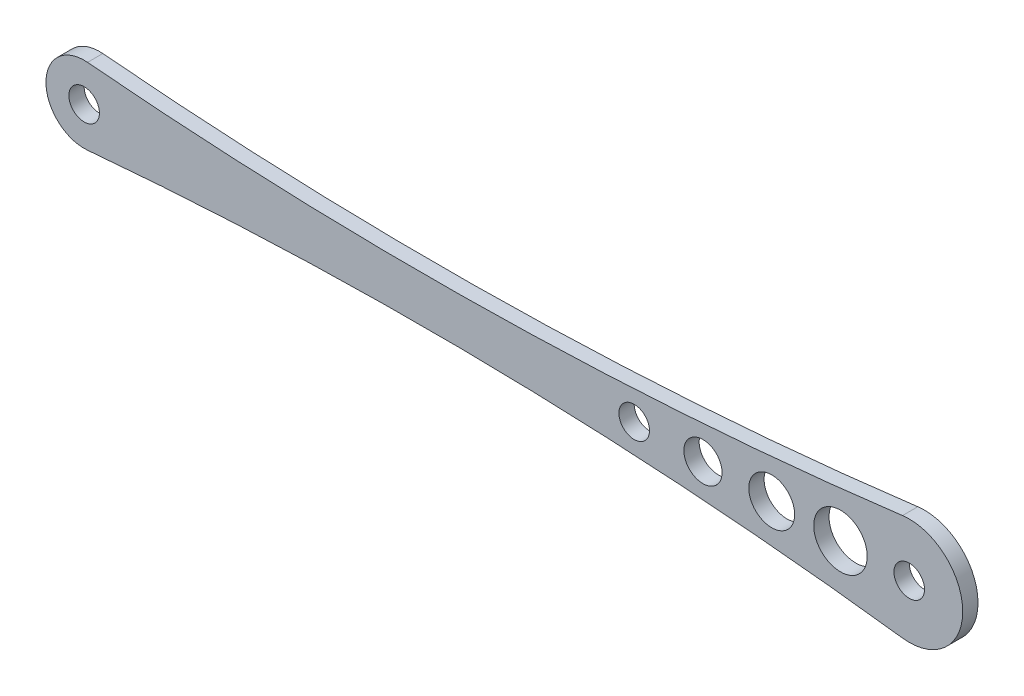
ISO-10303-21;
HEADER;
FILE_DESCRIPTION(('STEP AP214'),'2;1');
FILE_NAME('part.step','',(''),(''),'','','');
FILE_SCHEMA(('AUTOMOTIVE_DESIGN { 1 0 10303 214 1 1 1 1 }'));
ENDSEC;
DATA;
#1=APPLICATION_CONTEXT('core data for automotive mechanical design processes');
#2=APPLICATION_PROTOCOL_DEFINITION('international standard','automotive_design',2000,#1);
#3=PRODUCT_CONTEXT('',#1,'mechanical');
#4=PRODUCT('Part','Part','',(#3));
#5=PRODUCT_RELATED_PRODUCT_CATEGORY('part','',(#4));
#6=PRODUCT_DEFINITION_FORMATION('','',#4);
#7=PRODUCT_DEFINITION_CONTEXT('part definition',#1,'design');
#8=PRODUCT_DEFINITION('design','',#6,#7);
#9=PRODUCT_DEFINITION_SHAPE('','',#8);
#10=(LENGTH_UNIT() NAMED_UNIT(*) SI_UNIT(.MILLI.,.METRE.));
#11=(NAMED_UNIT(*) PLANE_ANGLE_UNIT() SI_UNIT($,.RADIAN.));
#12=(NAMED_UNIT(*) SI_UNIT($,.STERADIAN.) SOLID_ANGLE_UNIT());
#13=UNCERTAINTY_MEASURE_WITH_UNIT(LENGTH_MEASURE(1.E-05),#10,'distance_accuracy_value','');
#14=(GEOMETRIC_REPRESENTATION_CONTEXT(3) GLOBAL_UNCERTAINTY_ASSIGNED_CONTEXT((#13)) GLOBAL_UNIT_ASSIGNED_CONTEXT((#10,
#11,#12)) REPRESENTATION_CONTEXT('',''));
#15=CARTESIAN_POINT('',(0.,0.,0.));
#16=DIRECTION('',(0.,0.,1.));
#17=DIRECTION('',(1.,0.,0.));
#18=AXIS2_PLACEMENT_3D('',#15,#16,#17);
#19=CARTESIAN_POINT('',(38.1772183376422,124.680209767324,1.));
#20=DIRECTION('',(0.,0.,1.));
#21=DIRECTION('',(1.,0.,0.));
#22=AXIS2_PLACEMENT_3D('',#19,#20,#21);
#23=PLANE('',#22);
#24=CARTESIAN_POINT('',(40.5,0.,1.));
#25=DIRECTION('',(0.,0.,1.));
#26=DIRECTION('',(1.,0.,0.));
#27=AXIS2_PLACEMENT_3D('',#24,#25,#26);
#28=CIRCLE('',#27,1.25);
#29=CARTESIAN_POINT('',(41.75,0.,1.));
#30=VERTEX_POINT('',#29);
#31=EDGE_CURVE('E139',#30,#30,#28,.T.);
#32=ORIENTED_EDGE('',*,*,#31,.F.);
#33=EDGE_LOOP('',(#32));
#34=FACE_BOUND('',#33,.T.);
#35=CARTESIAN_POINT('',(49.5,0.,1.));
#36=DIRECTION('',(0.,0.,1.));
#37=DIRECTION('',(1.,0.,0.));
#38=AXIS2_PLACEMENT_3D('',#35,#36,#37);
#39=CIRCLE('',#38,1.75);
#40=CARTESIAN_POINT('',(51.25,0.,1.));
#41=VERTEX_POINT('',#40);
#42=EDGE_CURVE('E127',#41,#41,#39,.T.);
#43=ORIENTED_EDGE('',*,*,#42,.F.);
#44=EDGE_LOOP('',(#43));
#45=FACE_BOUND('',#44,.T.);
#46=CARTESIAN_POINT('',(0.,0.,1.));
#47=DIRECTION('',(0.,0.,1.));
#48=DIRECTION('',(1.,0.,0.));
#49=AXIS2_PLACEMENT_3D('',#46,#47,#48);
#50=CIRCLE('',#49,1.);
#51=CARTESIAN_POINT('',(1.,0.,1.));
#52=VERTEX_POINT('',#51);
#53=EDGE_CURVE('E106',#52,#52,#50,.T.);
#54=ORIENTED_EDGE('',*,*,#53,.F.);
#55=EDGE_LOOP('',(#54));
#56=FACE_BOUND('',#55,.T.);
#57=CARTESIAN_POINT('',(22.3544366752843,249.360419534648,1.));
#58=DIRECTION('',(0.,0.,-1.));
#59=DIRECTION('',(1.,0.,0.));
#60=AXIS2_PLACEMENT_3D('',#57,#58,#59);
#61=CIRCLE('',#60,247.860419534648);
#62=CARTESIAN_POINT('',(53.5593599348634,3.47215154234322,1.));
#63=VERTEX_POINT('',#62);
#64=CARTESIAN_POINT('',(0.223222551680044,2.49001439602694,1.));
#65=VERTEX_POINT('',#64);
#66=EDGE_CURVE('E91',#63,#65,#61,.T.);
#67=ORIENTED_EDGE('',*,*,#66,.T.);
#68=CARTESIAN_POINT('',(0.,0.,1.));
#69=DIRECTION('',(0.,0.,1.));
#70=DIRECTION('',(1.,0.,0.));
#71=AXIS2_PLACEMENT_3D('',#68,#69,#70);
#72=CIRCLE('',#71,2.49999999999999);
#73=CARTESIAN_POINT('',(0.223222551680044,-2.49001439602694,1.));
#74=VERTEX_POINT('',#73);
#75=EDGE_CURVE('E86',#65,#74,#72,.T.);
#76=ORIENTED_EDGE('',*,*,#75,.T.);
#77=CARTESIAN_POINT('',(22.3544366752843,-249.360419534648,1.));
#78=DIRECTION('',(0.,0.,-1.));
#79=DIRECTION('',(-1.,0.,0.));
#80=AXIS2_PLACEMENT_3D('',#77,#78,#79);
#81=CIRCLE('',#80,247.860419534648);
#82=CARTESIAN_POINT('',(53.5593599348634,-3.47215154234323,1.));
#83=VERTEX_POINT('',#82);
#84=EDGE_CURVE('E89',#74,#83,#81,.T.);
#85=ORIENTED_EDGE('',*,*,#84,.T.);
#86=CARTESIAN_POINT('',(54.,0.,1.));
#87=DIRECTION('',(0.,0.,1.));
#88=DIRECTION('',(1.,0.,0.));
#89=AXIS2_PLACEMENT_3D('',#86,#87,#88);
#90=CIRCLE('',#89,3.49999999999999);
#91=EDGE_CURVE('E56',#83,#63,#90,.T.);
#92=ORIENTED_EDGE('',*,*,#91,.T.);
#93=EDGE_LOOP('',(#67,#76,#85,#92));
#94=FACE_BOUND('',#93,.T.);
#95=CARTESIAN_POINT('',(54.,0.,1.));
#96=DIRECTION('',(0.,0.,1.));
#97=DIRECTION('',(1.,0.,0.));
#98=AXIS2_PLACEMENT_3D('',#95,#96,#97);
#99=CIRCLE('',#98,0.999999999999998);
#100=CARTESIAN_POINT('',(55.,0.,1.));
#101=VERTEX_POINT('',#100);
#102=EDGE_CURVE('E121',#101,#101,#99,.T.);
#103=ORIENTED_EDGE('',*,*,#102,.F.);
#104=EDGE_LOOP('',(#103));
#105=FACE_BOUND('',#104,.T.);
#106=CARTESIAN_POINT('',(45.,0.,1.));
#107=DIRECTION('',(0.,0.,1.));
#108=DIRECTION('',(1.,0.,0.));
#109=AXIS2_PLACEMENT_3D('',#106,#107,#108);
#110=CIRCLE('',#109,1.5);
#111=CARTESIAN_POINT('',(46.5,0.,1.));
#112=VERTEX_POINT('',#111);
#113=EDGE_CURVE('E133',#112,#112,#110,.T.);
#114=ORIENTED_EDGE('',*,*,#113,.F.);
#115=EDGE_LOOP('',(#114));
#116=FACE_BOUND('',#115,.T.);
#117=CARTESIAN_POINT('',(36.,0.,1.));
#118=DIRECTION('',(0.,0.,1.));
#119=DIRECTION('',(1.,0.,0.));
#120=AXIS2_PLACEMENT_3D('',#117,#118,#119);
#121=CIRCLE('',#120,0.999999999999998);
#122=CARTESIAN_POINT('',(37.,0.,1.));
#123=VERTEX_POINT('',#122);
#124=EDGE_CURVE('E145',#123,#123,#121,.T.);
#125=ORIENTED_EDGE('',*,*,#124,.F.);
#126=EDGE_LOOP('',(#125));
#127=FACE_BOUND('',#126,.T.);
#128=ADVANCED_FACE('F39',(#34,#45,#56,#94,#105,#116,#127),#23,.T.);
#129=CARTESIAN_POINT('',(38.1772183376422,124.680209767324,0.));
#130=DIRECTION('',(0.,0.,1.));
#131=DIRECTION('',(1.,0.,0.));
#132=AXIS2_PLACEMENT_3D('',#129,#130,#131);
#133=PLANE('',#132);
#134=CARTESIAN_POINT('',(22.3544366752843,249.360419534648,0.));
#135=DIRECTION('',(0.,0.,-1.));
#136=DIRECTION('',(1.,0.,0.));
#137=AXIS2_PLACEMENT_3D('',#134,#135,#136);
#138=CIRCLE('',#137,247.860419534648);
#139=CARTESIAN_POINT('',(53.5593599348634,3.47215154234322,0.));
#140=VERTEX_POINT('',#139);
#141=CARTESIAN_POINT('',(0.223222551680044,2.49001439602694,0.));
#142=VERTEX_POINT('',#141);
#143=EDGE_CURVE('E103',#140,#142,#138,.T.);
#144=ORIENTED_EDGE('',*,*,#143,.F.);
#145=CARTESIAN_POINT('',(54.,0.,0.));
#146=DIRECTION('',(0.,0.,1.));
#147=DIRECTION('',(1.,0.,0.));
#148=AXIS2_PLACEMENT_3D('',#145,#146,#147);
#149=CIRCLE('',#148,3.49999999999999);
#150=CARTESIAN_POINT('',(53.5593599348634,-3.47215154234323,0.));
#151=VERTEX_POINT('',#150);
#152=EDGE_CURVE('E79',#151,#140,#149,.T.);
#153=ORIENTED_EDGE('',*,*,#152,.F.);
#154=CARTESIAN_POINT('',(22.3544366752843,-249.360419534648,0.));
#155=DIRECTION('',(0.,0.,-1.));
#156=DIRECTION('',(-1.,0.,0.));
#157=AXIS2_PLACEMENT_3D('',#154,#155,#156);
#158=CIRCLE('',#157,247.860419534648);
#159=CARTESIAN_POINT('',(0.223222551680044,-2.49001439602694,0.));
#160=VERTEX_POINT('',#159);
#161=EDGE_CURVE('E73',#160,#151,#158,.T.);
#162=ORIENTED_EDGE('',*,*,#161,.F.);
#163=CARTESIAN_POINT('',(0.,0.,0.));
#164=DIRECTION('',(0.,0.,1.));
#165=DIRECTION('',(1.,0.,0.));
#166=AXIS2_PLACEMENT_3D('',#163,#164,#165);
#167=CIRCLE('',#166,2.49999999999999);
#168=EDGE_CURVE('E95',#142,#160,#167,.T.);
#169=ORIENTED_EDGE('',*,*,#168,.F.);
#170=EDGE_LOOP('',(#144,#153,#162,#169));
#171=FACE_BOUND('',#170,.T.);
#172=CARTESIAN_POINT('',(0.,0.,0.));
#173=DIRECTION('',(0.,0.,1.));
#174=DIRECTION('',(1.,0.,0.));
#175=AXIS2_PLACEMENT_3D('',#172,#173,#174);
#176=CIRCLE('',#175,1.);
#177=CARTESIAN_POINT('',(1.,0.,0.));
#178=VERTEX_POINT('',#177);
#179=EDGE_CURVE('E118',#178,#178,#176,.T.);
#180=ORIENTED_EDGE('',*,*,#179,.T.);
#181=EDGE_LOOP('',(#180));
#182=FACE_BOUND('',#181,.T.);
#183=CARTESIAN_POINT('',(54.,0.,0.));
#184=DIRECTION('',(0.,0.,1.));
#185=DIRECTION('',(1.,0.,0.));
#186=AXIS2_PLACEMENT_3D('',#183,#184,#185);
#187=CIRCLE('',#186,0.999999999999998);
#188=CARTESIAN_POINT('',(55.,0.,0.));
#189=VERTEX_POINT('',#188);
#190=EDGE_CURVE('E124',#189,#189,#187,.T.);
#191=ORIENTED_EDGE('',*,*,#190,.T.);
#192=EDGE_LOOP('',(#191));
#193=FACE_BOUND('',#192,.T.);
#194=CARTESIAN_POINT('',(49.5,0.,0.));
#195=DIRECTION('',(0.,0.,1.));
#196=DIRECTION('',(1.,0.,0.));
#197=AXIS2_PLACEMENT_3D('',#194,#195,#196);
#198=CIRCLE('',#197,1.75);
#199=CARTESIAN_POINT('',(51.25,0.,0.));
#200=VERTEX_POINT('',#199);
#201=EDGE_CURVE('E130',#200,#200,#198,.T.);
#202=ORIENTED_EDGE('',*,*,#201,.T.);
#203=EDGE_LOOP('',(#202));
#204=FACE_BOUND('',#203,.T.);
#205=CARTESIAN_POINT('',(45.,0.,0.));
#206=DIRECTION('',(0.,0.,1.));
#207=DIRECTION('',(1.,0.,0.));
#208=AXIS2_PLACEMENT_3D('',#205,#206,#207);
#209=CIRCLE('',#208,1.5);
#210=CARTESIAN_POINT('',(46.5,0.,0.));
#211=VERTEX_POINT('',#210);
#212=EDGE_CURVE('E136',#211,#211,#209,.T.);
#213=ORIENTED_EDGE('',*,*,#212,.T.);
#214=EDGE_LOOP('',(#213));
#215=FACE_BOUND('',#214,.T.);
#216=CARTESIAN_POINT('',(40.5,0.,0.));
#217=DIRECTION('',(0.,0.,1.));
#218=DIRECTION('',(1.,0.,0.));
#219=AXIS2_PLACEMENT_3D('',#216,#217,#218);
#220=CIRCLE('',#219,1.25);
#221=CARTESIAN_POINT('',(41.75,0.,0.));
#222=VERTEX_POINT('',#221);
#223=EDGE_CURVE('E142',#222,#222,#220,.T.);
#224=ORIENTED_EDGE('',*,*,#223,.T.);
#225=EDGE_LOOP('',(#224));
#226=FACE_BOUND('',#225,.T.);
#227=CARTESIAN_POINT('',(36.,0.,0.));
#228=DIRECTION('',(0.,0.,1.));
#229=DIRECTION('',(1.,0.,0.));
#230=AXIS2_PLACEMENT_3D('',#227,#228,#229);
#231=CIRCLE('',#230,0.999999999999998);
#232=CARTESIAN_POINT('',(37.,0.,0.));
#233=VERTEX_POINT('',#232);
#234=EDGE_CURVE('E148',#233,#233,#231,.T.);
#235=ORIENTED_EDGE('',*,*,#234,.T.);
#236=EDGE_LOOP('',(#235));
#237=FACE_BOUND('',#236,.T.);
#238=ADVANCED_FACE('F114',(#171,#182,#193,#204,#215,#226,#237),#133,.F.);
#239=CARTESIAN_POINT('',(22.3544366752843,249.360419534648,1.));
#240=DIRECTION('',(0.,0.,-1.));
#241=DIRECTION('',(-1.,0.,0.));
#242=AXIS2_PLACEMENT_3D('',#239,#240,#241);
#243=CYLINDRICAL_SURFACE('',#242,247.860419534648);
#244=ORIENTED_EDGE('',*,*,#143,.T.);
#245=DIRECTION('',(0.,0.,-1.));
#246=VECTOR('',#245,1.);
#247=CARTESIAN_POINT('',(0.223222551680044,2.49001439602694,1.));
#248=LINE('',#247,#246);
#249=EDGE_CURVE('E11',#65,#142,#248,.T.);
#250=ORIENTED_EDGE('',*,*,#249,.F.);
#251=ORIENTED_EDGE('',*,*,#66,.F.);
#252=DIRECTION('',(0.,0.,-1.));
#253=VECTOR('',#252,1.);
#254=CARTESIAN_POINT('',(53.5593599348634,3.47215154234322,1.));
#255=LINE('',#254,#253);
#256=EDGE_CURVE('E99',#63,#140,#255,.T.);
#257=ORIENTED_EDGE('',*,*,#256,.T.);
#258=EDGE_LOOP('',(#244,#250,#251,#257));
#259=FACE_BOUND('',#258,.T.);
#260=ADVANCED_FACE('F41',(#259),#243,.F.);
#261=CARTESIAN_POINT('',(0.,0.,1.));
#262=DIRECTION('',(0.,0.,-1.));
#263=DIRECTION('',(-1.,0.,0.));
#264=AXIS2_PLACEMENT_3D('',#261,#262,#263);
#265=CYLINDRICAL_SURFACE('',#264,2.49999999999999);
#266=ORIENTED_EDGE('',*,*,#168,.T.);
#267=DIRECTION('',(0.,0.,-1.));
#268=VECTOR('',#267,1.);
#269=CARTESIAN_POINT('',(0.223222551680044,-2.49001439602694,1.));
#270=LINE('',#269,#268);
#271=EDGE_CURVE('E48',#74,#160,#270,.T.);
#272=ORIENTED_EDGE('',*,*,#271,.F.);
#273=ORIENTED_EDGE('',*,*,#75,.F.);
#274=ORIENTED_EDGE('',*,*,#249,.T.);
#275=EDGE_LOOP('',(#266,#272,#273,#274));
#276=FACE_BOUND('',#275,.T.);
#277=ADVANCED_FACE('F94',(#276),#265,.T.);
#278=CARTESIAN_POINT('',(22.3544366752843,-249.360419534648,1.));
#279=DIRECTION('',(0.,0.,-1.));
#280=DIRECTION('',(-1.,0.,0.));
#281=AXIS2_PLACEMENT_3D('',#278,#279,#280);
#282=CYLINDRICAL_SURFACE('',#281,247.860419534648);
#283=ORIENTED_EDGE('',*,*,#161,.T.);
#284=DIRECTION('',(0.,0.,-1.));
#285=VECTOR('',#284,1.);
#286=CARTESIAN_POINT('',(53.5593599348634,-3.47215154234323,1.));
#287=LINE('',#286,#285);
#288=EDGE_CURVE('E96',#83,#151,#287,.T.);
#289=ORIENTED_EDGE('',*,*,#288,.F.);
#290=ORIENTED_EDGE('',*,*,#84,.F.);
#291=ORIENTED_EDGE('',*,*,#271,.T.);
#292=EDGE_LOOP('',(#283,#289,#290,#291));
#293=FACE_BOUND('',#292,.T.);
#294=ADVANCED_FACE('F97',(#293),#282,.F.);
#295=CARTESIAN_POINT('',(54.,0.,1.));
#296=DIRECTION('',(0.,0.,-1.));
#297=DIRECTION('',(-1.,0.,0.));
#298=AXIS2_PLACEMENT_3D('',#295,#296,#297);
#299=CYLINDRICAL_SURFACE('',#298,3.49999999999999);
#300=ORIENTED_EDGE('',*,*,#152,.T.);
#301=ORIENTED_EDGE('',*,*,#256,.F.);
#302=ORIENTED_EDGE('',*,*,#91,.F.);
#303=ORIENTED_EDGE('',*,*,#288,.T.);
#304=EDGE_LOOP('',(#300,#301,#302,#303));
#305=FACE_BOUND('',#304,.T.);
#306=ADVANCED_FACE('F111',(#305),#299,.T.);
#307=CARTESIAN_POINT('',(0.,0.,1.));
#308=DIRECTION('',(0.,0.,-1.));
#309=DIRECTION('',(-1.,0.,0.));
#310=AXIS2_PLACEMENT_3D('',#307,#308,#309);
#311=CYLINDRICAL_SURFACE('',#310,1.);
#312=ORIENTED_EDGE('',*,*,#53,.T.);
#313=EDGE_LOOP('',(#312));
#314=FACE_BOUND('',#313,.T.);
#315=ORIENTED_EDGE('',*,*,#179,.F.);
#316=EDGE_LOOP('',(#315));
#317=FACE_BOUND('',#316,.T.);
#318=ADVANCED_FACE('F167',(#314,#317),#311,.F.);
#319=CARTESIAN_POINT('',(54.,0.,1.));
#320=DIRECTION('',(0.,0.,-1.));
#321=DIRECTION('',(-1.,0.,0.));
#322=AXIS2_PLACEMENT_3D('',#319,#320,#321);
#323=CYLINDRICAL_SURFACE('',#322,0.999999999999998);
#324=ORIENTED_EDGE('',*,*,#102,.T.);
#325=EDGE_LOOP('',(#324));
#326=FACE_BOUND('',#325,.T.);
#327=ORIENTED_EDGE('',*,*,#190,.F.);
#328=EDGE_LOOP('',(#327));
#329=FACE_BOUND('',#328,.T.);
#330=ADVANCED_FACE('F221',(#326,#329),#323,.F.);
#331=CARTESIAN_POINT('',(49.5,0.,1.));
#332=DIRECTION('',(0.,0.,-1.));
#333=DIRECTION('',(-1.,0.,0.));
#334=AXIS2_PLACEMENT_3D('',#331,#332,#333);
#335=CYLINDRICAL_SURFACE('',#334,1.75);
#336=ORIENTED_EDGE('',*,*,#42,.T.);
#337=EDGE_LOOP('',(#336));
#338=FACE_BOUND('',#337,.T.);
#339=ORIENTED_EDGE('',*,*,#201,.F.);
#340=EDGE_LOOP('',(#339));
#341=FACE_BOUND('',#340,.T.);
#342=ADVANCED_FACE('F230',(#338,#341),#335,.F.);
#343=CARTESIAN_POINT('',(45.,0.,1.));
#344=DIRECTION('',(0.,0.,-1.));
#345=DIRECTION('',(-1.,0.,0.));
#346=AXIS2_PLACEMENT_3D('',#343,#344,#345);
#347=CYLINDRICAL_SURFACE('',#346,1.5);
#348=ORIENTED_EDGE('',*,*,#113,.T.);
#349=EDGE_LOOP('',(#348));
#350=FACE_BOUND('',#349,.T.);
#351=ORIENTED_EDGE('',*,*,#212,.F.);
#352=EDGE_LOOP('',(#351));
#353=FACE_BOUND('',#352,.T.);
#354=ADVANCED_FACE('F239',(#350,#353),#347,.F.);
#355=CARTESIAN_POINT('',(40.5,0.,1.));
#356=DIRECTION('',(0.,0.,-1.));
#357=DIRECTION('',(-1.,0.,0.));
#358=AXIS2_PLACEMENT_3D('',#355,#356,#357);
#359=CYLINDRICAL_SURFACE('',#358,1.25);
#360=ORIENTED_EDGE('',*,*,#31,.T.);
#361=EDGE_LOOP('',(#360));
#362=FACE_BOUND('',#361,.T.);
#363=ORIENTED_EDGE('',*,*,#223,.F.);
#364=EDGE_LOOP('',(#363));
#365=FACE_BOUND('',#364,.T.);
#366=ADVANCED_FACE('F249',(#362,#365),#359,.F.);
#367=CARTESIAN_POINT('',(36.,0.,1.));
#368=DIRECTION('',(0.,0.,-1.));
#369=DIRECTION('',(-1.,0.,0.));
#370=AXIS2_PLACEMENT_3D('',#367,#368,#369);
#371=CYLINDRICAL_SURFACE('',#370,0.999999999999998);
#372=ORIENTED_EDGE('',*,*,#124,.T.);
#373=EDGE_LOOP('',(#372));
#374=FACE_BOUND('',#373,.T.);
#375=ORIENTED_EDGE('',*,*,#234,.F.);
#376=EDGE_LOOP('',(#375));
#377=FACE_BOUND('',#376,.T.);
#378=ADVANCED_FACE('F154',(#374,#377),#371,.F.);
#379=CLOSED_SHELL('',(#128,#238,#260,#277,#294,#306,#318,#330,#342,#354,#366,#378));
#380=MANIFOLD_SOLID_BREP('B2',#379);
#381=ADVANCED_BREP_SHAPE_REPRESENTATION('',(#18,#380),#14);
#382=SHAPE_DEFINITION_REPRESENTATION(#9,#381);
ENDSEC;
END-ISO-10303-21;
